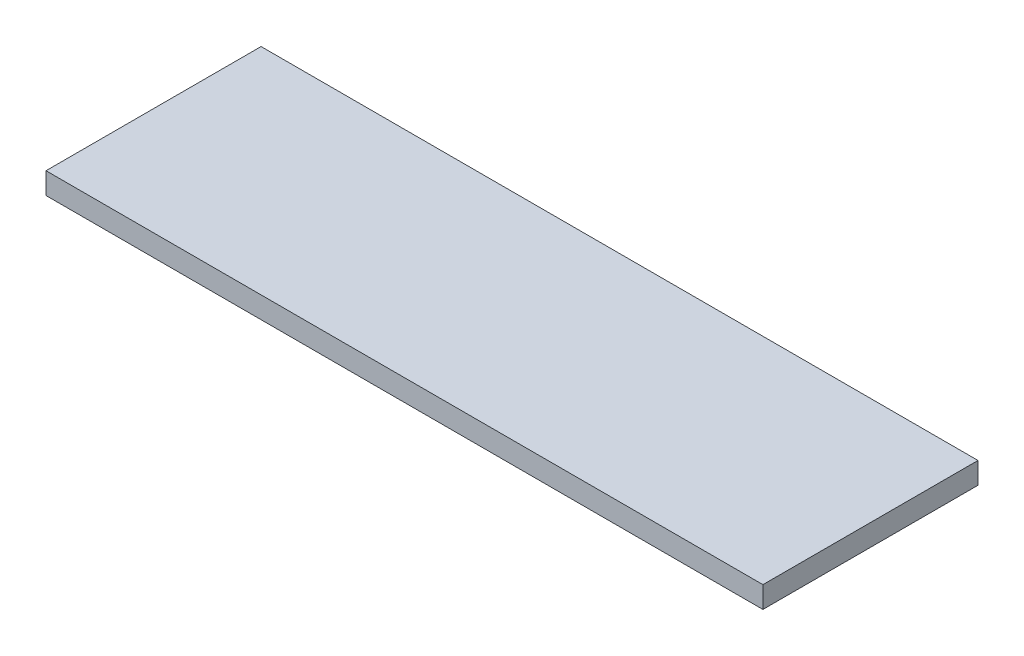
ISO-10303-21;
HEADER;
FILE_DESCRIPTION(('STEP AP214'),'2;1');
FILE_NAME('part.step','',(''),(''),'','','');
FILE_SCHEMA(('AUTOMOTIVE_DESIGN { 1 0 10303 214 1 1 1 1 }'));
ENDSEC;
DATA;
#1=APPLICATION_CONTEXT('core data for automotive mechanical design processes');
#2=APPLICATION_PROTOCOL_DEFINITION('international standard','automotive_design',2000,#1);
#3=PRODUCT_CONTEXT('',#1,'mechanical');
#4=PRODUCT('Part','Part','',(#3));
#5=PRODUCT_RELATED_PRODUCT_CATEGORY('part','',(#4));
#6=PRODUCT_DEFINITION_FORMATION('','',#4);
#7=PRODUCT_DEFINITION_CONTEXT('part definition',#1,'design');
#8=PRODUCT_DEFINITION('design','',#6,#7);
#9=PRODUCT_DEFINITION_SHAPE('','',#8);
#10=(LENGTH_UNIT() NAMED_UNIT(*) SI_UNIT(.MILLI.,.METRE.));
#11=(NAMED_UNIT(*) PLANE_ANGLE_UNIT() SI_UNIT($,.RADIAN.));
#12=(NAMED_UNIT(*) SI_UNIT($,.STERADIAN.) SOLID_ANGLE_UNIT());
#13=UNCERTAINTY_MEASURE_WITH_UNIT(LENGTH_MEASURE(1.E-05),#10,'distance_accuracy_value','');
#14=(GEOMETRIC_REPRESENTATION_CONTEXT(3) GLOBAL_UNCERTAINTY_ASSIGNED_CONTEXT((#13)) GLOBAL_UNIT_ASSIGNED_CONTEXT((#10,
#11,#12)) REPRESENTATION_CONTEXT('',''));
#15=CARTESIAN_POINT('',(0.,0.,0.));
#16=DIRECTION('',(0.,0.,1.));
#17=DIRECTION('',(1.,0.,0.));
#18=AXIS2_PLACEMENT_3D('',#15,#16,#17);
#19=CARTESIAN_POINT('',(-216.,15.,46.75));
#20=DIRECTION('',(1.,0.,0.));
#21=DIRECTION('',(0.,0.,-1.));
#22=AXIS2_PLACEMENT_3D('',#19,#20,#21);
#23=PLANE('',#22);
#24=DIRECTION('',(0.,0.,1.));
#25=VECTOR('',#24,1.);
#26=CARTESIAN_POINT('',(-216.,0.,46.75));
#27=LINE('',#26,#25);
#28=CARTESIAN_POINT('',(-216.,0.,-103.25));
#29=VERTEX_POINT('',#28);
#30=CARTESIAN_POINT('',(-216.,0.,46.75));
#31=VERTEX_POINT('',#30);
#32=EDGE_CURVE('E95',#29,#31,#27,.T.);
#33=ORIENTED_EDGE('',*,*,#32,.T.);
#34=DIRECTION('',(0.,-1.,0.));
#35=VECTOR('',#34,1.);
#36=CARTESIAN_POINT('',(-216.,15.,46.75));
#37=LINE('',#36,#35);
#38=CARTESIAN_POINT('',(-216.,15.,46.75));
#39=VERTEX_POINT('',#38);
#40=EDGE_CURVE('E11',#39,#31,#37,.T.);
#41=ORIENTED_EDGE('',*,*,#40,.F.);
#42=DIRECTION('',(0.,0.,1.));
#43=VECTOR('',#42,1.);
#44=CARTESIAN_POINT('',(-216.,15.,46.75));
#45=LINE('',#44,#43);
#46=CARTESIAN_POINT('',(-216.,15.,-103.25));
#47=VERTEX_POINT('',#46);
#48=EDGE_CURVE('E83',#47,#39,#45,.T.);
#49=ORIENTED_EDGE('',*,*,#48,.F.);
#50=DIRECTION('',(0.,-1.,0.));
#51=VECTOR('',#50,1.);
#52=CARTESIAN_POINT('',(-216.,15.,-103.25));
#53=LINE('',#52,#51);
#54=EDGE_CURVE('E91',#47,#29,#53,.T.);
#55=ORIENTED_EDGE('',*,*,#54,.T.);
#56=EDGE_LOOP('',(#33,#41,#49,#55));
#57=FACE_BOUND('',#56,.T.);
#58=ADVANCED_FACE('F32',(#57),#23,.F.);
#59=CARTESIAN_POINT('',(284.,15.,46.7499999999999));
#60=DIRECTION('',(0.,0.,-1.));
#61=DIRECTION('',(-1.,0.,0.));
#62=AXIS2_PLACEMENT_3D('',#59,#60,#61);
#63=PLANE('',#62);
#64=DIRECTION('',(1.,0.,0.));
#65=VECTOR('',#64,1.);
#66=CARTESIAN_POINT('',(284.,0.,46.7499999999999));
#67=LINE('',#66,#65);
#68=CARTESIAN_POINT('',(284.,0.,46.7499999999999));
#69=VERTEX_POINT('',#68);
#70=EDGE_CURVE('E87',#31,#69,#67,.T.);
#71=ORIENTED_EDGE('',*,*,#70,.T.);
#72=DIRECTION('',(0.,-1.,0.));
#73=VECTOR('',#72,1.);
#74=CARTESIAN_POINT('',(284.,15.,46.7499999999999));
#75=LINE('',#74,#73);
#76=CARTESIAN_POINT('',(284.,15.,46.7499999999999));
#77=VERTEX_POINT('',#76);
#78=EDGE_CURVE('E40',#77,#69,#75,.T.);
#79=ORIENTED_EDGE('',*,*,#78,.F.);
#80=DIRECTION('',(1.,0.,0.));
#81=VECTOR('',#80,1.);
#82=CARTESIAN_POINT('',(284.,15.,46.7499999999999));
#83=LINE('',#82,#81);
#84=EDGE_CURVE('E78',#39,#77,#83,.T.);
#85=ORIENTED_EDGE('',*,*,#84,.F.);
#86=ORIENTED_EDGE('',*,*,#40,.T.);
#87=EDGE_LOOP('',(#71,#79,#85,#86));
#88=FACE_BOUND('',#87,.T.);
#89=ADVANCED_FACE('F86',(#88),#63,.F.);
#90=CARTESIAN_POINT('',(284.,15.,46.7499999999999));
#91=DIRECTION('',(-1.,0.,0.));
#92=DIRECTION('',(0.,0.,1.));
#93=AXIS2_PLACEMENT_3D('',#90,#91,#92);
#94=PLANE('',#93);
#95=DIRECTION('',(0.,0.,-1.));
#96=VECTOR('',#95,1.);
#97=CARTESIAN_POINT('',(284.,0.,46.7499999999999));
#98=LINE('',#97,#96);
#99=CARTESIAN_POINT('',(284.,0.,-103.25));
#100=VERTEX_POINT('',#99);
#101=EDGE_CURVE('E65',#69,#100,#98,.T.);
#102=ORIENTED_EDGE('',*,*,#101,.T.);
#103=DIRECTION('',(0.,-1.,0.));
#104=VECTOR('',#103,1.);
#105=CARTESIAN_POINT('',(284.,15.,-103.25));
#106=LINE('',#105,#104);
#107=CARTESIAN_POINT('',(284.,15.,-103.25));
#108=VERTEX_POINT('',#107);
#109=EDGE_CURVE('E88',#108,#100,#106,.T.);
#110=ORIENTED_EDGE('',*,*,#109,.F.);
#111=DIRECTION('',(0.,0.,-1.));
#112=VECTOR('',#111,1.);
#113=CARTESIAN_POINT('',(284.,15.,46.7499999999999));
#114=LINE('',#113,#112);
#115=EDGE_CURVE('E81',#77,#108,#114,.T.);
#116=ORIENTED_EDGE('',*,*,#115,.F.);
#117=ORIENTED_EDGE('',*,*,#78,.T.);
#118=EDGE_LOOP('',(#102,#110,#116,#117));
#119=FACE_BOUND('',#118,.T.);
#120=ADVANCED_FACE('F89',(#119),#94,.F.);
#121=CARTESIAN_POINT('',(284.,15.,-103.25));
#122=DIRECTION('',(0.,0.,1.));
#123=DIRECTION('',(1.,0.,0.));
#124=AXIS2_PLACEMENT_3D('',#121,#122,#123);
#125=PLANE('',#124);
#126=DIRECTION('',(-1.,0.,0.));
#127=VECTOR('',#126,1.);
#128=CARTESIAN_POINT('',(284.,0.,-103.25));
#129=LINE('',#128,#127);
#130=EDGE_CURVE('E71',#100,#29,#129,.T.);
#131=ORIENTED_EDGE('',*,*,#130,.T.);
#132=ORIENTED_EDGE('',*,*,#54,.F.);
#133=DIRECTION('',(-1.,0.,0.));
#134=VECTOR('',#133,1.);
#135=CARTESIAN_POINT('',(284.,15.,-103.25));
#136=LINE('',#135,#134);
#137=EDGE_CURVE('E48',#108,#47,#136,.T.);
#138=ORIENTED_EDGE('',*,*,#137,.F.);
#139=ORIENTED_EDGE('',*,*,#109,.T.);
#140=EDGE_LOOP('',(#131,#132,#138,#139));
#141=FACE_BOUND('',#140,.T.);
#142=ADVANCED_FACE('F102',(#141),#125,.F.);
#143=CARTESIAN_POINT('',(0.,15.,0.));
#144=DIRECTION('',(0.,1.,0.));
#145=DIRECTION('',(0.,0.,1.));
#146=AXIS2_PLACEMENT_3D('',#143,#144,#145);
#147=PLANE('',#146);
#148=ORIENTED_EDGE('',*,*,#48,.T.);
#149=ORIENTED_EDGE('',*,*,#84,.T.);
#150=ORIENTED_EDGE('',*,*,#115,.T.);
#151=ORIENTED_EDGE('',*,*,#137,.T.);
#152=EDGE_LOOP('',(#148,#149,#150,#151));
#153=FACE_BOUND('',#152,.T.);
#154=ADVANCED_FACE('F79',(#153),#147,.T.);
#155=CARTESIAN_POINT('',(0.,0.,0.));
#156=DIRECTION('',(0.,1.,0.));
#157=DIRECTION('',(0.,0.,1.));
#158=AXIS2_PLACEMENT_3D('',#155,#156,#157);
#159=PLANE('',#158);
#160=ORIENTED_EDGE('',*,*,#32,.F.);
#161=ORIENTED_EDGE('',*,*,#130,.F.);
#162=ORIENTED_EDGE('',*,*,#101,.F.);
#163=ORIENTED_EDGE('',*,*,#70,.F.);
#164=EDGE_LOOP('',(#160,#161,#162,#163));
#165=FACE_BOUND('',#164,.T.);
#166=ADVANCED_FACE('F105',(#165),#159,.F.);
#167=CLOSED_SHELL('',(#58,#89,#120,#142,#154,#166));
#168=MANIFOLD_SOLID_BREP('B2',#167);
#169=ADVANCED_BREP_SHAPE_REPRESENTATION('',(#18,#168),#14);
#170=SHAPE_DEFINITION_REPRESENTATION(#9,#169);
ENDSEC;
END-ISO-10303-21;
